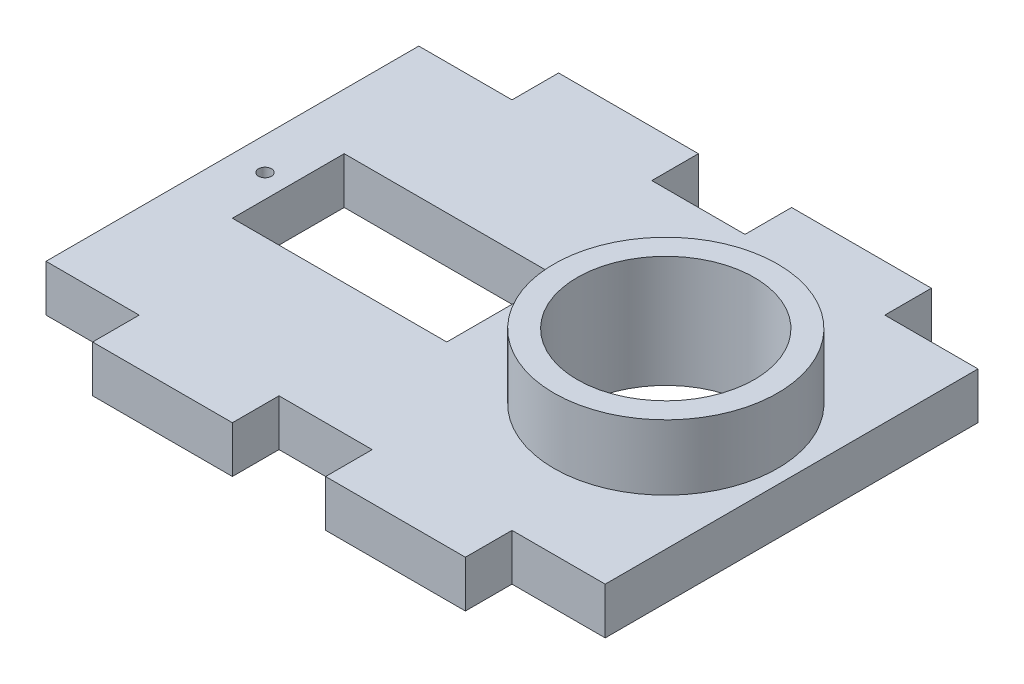
ISO-10303-21;
HEADER;
FILE_DESCRIPTION(('STEP AP214'),'2;1');
FILE_NAME('part.step','',(''),(''),'','','');
FILE_SCHEMA(('AUTOMOTIVE_DESIGN { 1 0 10303 214 1 1 1 1 }'));
ENDSEC;
DATA;
#1=APPLICATION_CONTEXT('core data for automotive mechanical design processes');
#2=APPLICATION_PROTOCOL_DEFINITION('international standard','automotive_design',2000,#1);
#3=PRODUCT_CONTEXT('',#1,'mechanical');
#4=PRODUCT('Part','Part','',(#3));
#5=PRODUCT_RELATED_PRODUCT_CATEGORY('part','',(#4));
#6=PRODUCT_DEFINITION_FORMATION('','',#4);
#7=PRODUCT_DEFINITION_CONTEXT('part definition',#1,'design');
#8=PRODUCT_DEFINITION('design','',#6,#7);
#9=PRODUCT_DEFINITION_SHAPE('','',#8);
#10=(LENGTH_UNIT() NAMED_UNIT(*) SI_UNIT(.MILLI.,.METRE.));
#11=(NAMED_UNIT(*) PLANE_ANGLE_UNIT() SI_UNIT($,.RADIAN.));
#12=(NAMED_UNIT(*) SI_UNIT($,.STERADIAN.) SOLID_ANGLE_UNIT());
#13=UNCERTAINTY_MEASURE_WITH_UNIT(LENGTH_MEASURE(1.E-05),#10,'distance_accuracy_value','');
#14=(GEOMETRIC_REPRESENTATION_CONTEXT(3) GLOBAL_UNCERTAINTY_ASSIGNED_CONTEXT((#13)) GLOBAL_UNIT_ASSIGNED_CONTEXT((#10,
#11,#12)) REPRESENTATION_CONTEXT('',''));
#15=CARTESIAN_POINT('',(0.,0.,0.));
#16=DIRECTION('',(0.,0.,1.));
#17=DIRECTION('',(1.,0.,0.));
#18=AXIS2_PLACEMENT_3D('',#15,#16,#17);
#19=CARTESIAN_POINT('',(0.,5.,0.));
#20=DIRECTION('',(0.,1.,0.));
#21=DIRECTION('',(0.,0.,1.));
#22=AXIS2_PLACEMENT_3D('',#19,#20,#21);
#23=PLANE('',#22);
#24=CARTESIAN_POINT('',(-14.,5.,0.));
#25=DIRECTION('',(0.,1.,0.));
#26=DIRECTION('',(0.,0.,1.));
#27=AXIS2_PLACEMENT_3D('',#24,#25,#26);
#28=CIRCLE('',#27,0.7);
#29=CARTESIAN_POINT('',(-14.,5.,0.7));
#30=VERTEX_POINT('',#29);
#31=EDGE_CURVE('E260',#30,#30,#28,.T.);
#32=ORIENTED_EDGE('',*,*,#31,.F.);
#33=EDGE_LOOP('',(#32));
#34=FACE_BOUND('',#33,.T.);
#35=DIRECTION('',(-1.,0.,0.));
#36=VECTOR('',#35,1.);
#37=CARTESIAN_POINT('',(32.5,5.,-20.));
#38=LINE('',#37,#36);
#39=CARTESIAN_POINT('',(42.5,5.,-20.));
#40=VERTEX_POINT('',#39);
#41=CARTESIAN_POINT('',(32.5,5.,-20.));
#42=VERTEX_POINT('',#41);
#43=EDGE_CURVE('E268',#40,#42,#38,.T.);
#44=ORIENTED_EDGE('',*,*,#43,.T.);
#45=DIRECTION('',(0.,0.,-1.));
#46=VECTOR('',#45,1.);
#47=CARTESIAN_POINT('',(32.5,5.,-20.));
#48=LINE('',#47,#46);
#49=CARTESIAN_POINT('',(32.5,5.,-25.));
#50=VERTEX_POINT('',#49);
#51=EDGE_CURVE('E272',#42,#50,#48,.T.);
#52=ORIENTED_EDGE('',*,*,#51,.T.);
#53=DIRECTION('',(-1.,0.,0.));
#54=VECTOR('',#53,1.);
#55=CARTESIAN_POINT('',(32.5,5.,-25.));
#56=LINE('',#55,#54);
#57=CARTESIAN_POINT('',(17.5,5.,-25.));
#58=VERTEX_POINT('',#57);
#59=EDGE_CURVE('E276',#50,#58,#56,.T.);
#60=ORIENTED_EDGE('',*,*,#59,.T.);
#61=DIRECTION('',(0.,0.,1.));
#62=VECTOR('',#61,1.);
#63=CARTESIAN_POINT('',(17.5,5.,-20.));
#64=LINE('',#63,#62);
#65=CARTESIAN_POINT('',(17.5,5.,-20.));
#66=VERTEX_POINT('',#65);
#67=EDGE_CURVE('E279',#58,#66,#64,.T.);
#68=ORIENTED_EDGE('',*,*,#67,.T.);
#69=DIRECTION('',(-1.,0.,0.));
#70=VECTOR('',#69,1.);
#71=CARTESIAN_POINT('',(7.5,5.,-20.));
#72=LINE('',#71,#70);
#73=CARTESIAN_POINT('',(7.5,5.,-20.));
#74=VERTEX_POINT('',#73);
#75=EDGE_CURVE('E282',#66,#74,#72,.T.);
#76=ORIENTED_EDGE('',*,*,#75,.T.);
#77=DIRECTION('',(0.,0.,-1.));
#78=VECTOR('',#77,1.);
#79=CARTESIAN_POINT('',(7.5,5.,-20.));
#80=LINE('',#79,#78);
#81=CARTESIAN_POINT('',(7.5,5.,-25.));
#82=VERTEX_POINT('',#81);
#83=EDGE_CURVE('E285',#74,#82,#80,.T.);
#84=ORIENTED_EDGE('',*,*,#83,.T.);
#85=DIRECTION('',(-1.,0.,0.));
#86=VECTOR('',#85,1.);
#87=CARTESIAN_POINT('',(-7.5,5.,-25.));
#88=LINE('',#87,#86);
#89=CARTESIAN_POINT('',(-7.5,5.,-25.));
#90=VERTEX_POINT('',#89);
#91=EDGE_CURVE('E288',#82,#90,#88,.T.);
#92=ORIENTED_EDGE('',*,*,#91,.T.);
#93=DIRECTION('',(0.,0.,1.));
#94=VECTOR('',#93,1.);
#95=CARTESIAN_POINT('',(-7.5,5.,-20.));
#96=LINE('',#95,#94);
#97=CARTESIAN_POINT('',(-7.5,5.,-20.));
#98=VERTEX_POINT('',#97);
#99=EDGE_CURVE('E291',#90,#98,#96,.T.);
#100=ORIENTED_EDGE('',*,*,#99,.T.);
#101=DIRECTION('',(-1.,0.,0.));
#102=VECTOR('',#101,1.);
#103=CARTESIAN_POINT('',(-17.5,5.,-20.));
#104=LINE('',#103,#102);
#105=CARTESIAN_POINT('',(-17.5,5.,-20.));
#106=VERTEX_POINT('',#105);
#107=EDGE_CURVE('E294',#98,#106,#104,.T.);
#108=ORIENTED_EDGE('',*,*,#107,.T.);
#109=DIRECTION('',(0.,0.,1.));
#110=VECTOR('',#109,1.);
#111=CARTESIAN_POINT('',(-17.5,5.,20.));
#112=LINE('',#111,#110);
#113=CARTESIAN_POINT('',(-17.5,5.,20.));
#114=VERTEX_POINT('',#113);
#115=EDGE_CURVE('E297',#106,#114,#112,.T.);
#116=ORIENTED_EDGE('',*,*,#115,.T.);
#117=DIRECTION('',(1.,0.,0.));
#118=VECTOR('',#117,1.);
#119=CARTESIAN_POINT('',(-17.5,5.,20.));
#120=LINE('',#119,#118);
#121=CARTESIAN_POINT('',(-7.49999999999999,5.,20.));
#122=VERTEX_POINT('',#121);
#123=EDGE_CURVE('E300',#114,#122,#120,.T.);
#124=ORIENTED_EDGE('',*,*,#123,.T.);
#125=DIRECTION('',(0.,0.,1.));
#126=VECTOR('',#125,1.);
#127=CARTESIAN_POINT('',(-7.49999999999999,5.,20.));
#128=LINE('',#127,#126);
#129=CARTESIAN_POINT('',(-7.49999999999999,5.,25.));
#130=VERTEX_POINT('',#129);
#131=EDGE_CURVE('E303',#122,#130,#128,.T.);
#132=ORIENTED_EDGE('',*,*,#131,.T.);
#133=DIRECTION('',(1.,0.,0.));
#134=VECTOR('',#133,1.);
#135=CARTESIAN_POINT('',(-7.49999999999999,5.,25.));
#136=LINE('',#135,#134);
#137=CARTESIAN_POINT('',(7.50000000000001,5.,25.));
#138=VERTEX_POINT('',#137);
#139=EDGE_CURVE('E306',#130,#138,#136,.T.);
#140=ORIENTED_EDGE('',*,*,#139,.T.);
#141=DIRECTION('',(0.,0.,-1.));
#142=VECTOR('',#141,1.);
#143=CARTESIAN_POINT('',(7.5,5.,20.));
#144=LINE('',#143,#142);
#145=CARTESIAN_POINT('',(7.5,5.,20.));
#146=VERTEX_POINT('',#145);
#147=EDGE_CURVE('E309',#138,#146,#144,.T.);
#148=ORIENTED_EDGE('',*,*,#147,.T.);
#149=DIRECTION('',(1.,0.,0.));
#150=VECTOR('',#149,1.);
#151=CARTESIAN_POINT('',(7.5,5.,20.));
#152=LINE('',#151,#150);
#153=CARTESIAN_POINT('',(17.5,5.,20.));
#154=VERTEX_POINT('',#153);
#155=EDGE_CURVE('E312',#146,#154,#152,.T.);
#156=ORIENTED_EDGE('',*,*,#155,.T.);
#157=DIRECTION('',(0.,0.,1.));
#158=VECTOR('',#157,1.);
#159=CARTESIAN_POINT('',(17.5,5.,20.));
#160=LINE('',#159,#158);
#161=CARTESIAN_POINT('',(17.5,5.,25.));
#162=VERTEX_POINT('',#161);
#163=EDGE_CURVE('E315',#154,#162,#160,.T.);
#164=ORIENTED_EDGE('',*,*,#163,.T.);
#165=DIRECTION('',(1.,0.,0.));
#166=VECTOR('',#165,1.);
#167=CARTESIAN_POINT('',(32.5,5.,25.));
#168=LINE('',#167,#166);
#169=CARTESIAN_POINT('',(32.5,5.,25.));
#170=VERTEX_POINT('',#169);
#171=EDGE_CURVE('E318',#162,#170,#168,.T.);
#172=ORIENTED_EDGE('',*,*,#171,.T.);
#173=DIRECTION('',(0.,0.,-1.));
#174=VECTOR('',#173,1.);
#175=CARTESIAN_POINT('',(32.5,5.,20.));
#176=LINE('',#175,#174);
#177=CARTESIAN_POINT('',(32.5,5.,20.));
#178=VERTEX_POINT('',#177);
#179=EDGE_CURVE('E321',#170,#178,#176,.T.);
#180=ORIENTED_EDGE('',*,*,#179,.T.);
#181=DIRECTION('',(1.,0.,0.));
#182=VECTOR('',#181,1.);
#183=CARTESIAN_POINT('',(32.5,5.,20.));
#184=LINE('',#183,#182);
#185=CARTESIAN_POINT('',(42.5,5.,20.));
#186=VERTEX_POINT('',#185);
#187=EDGE_CURVE('E324',#178,#186,#184,.T.);
#188=ORIENTED_EDGE('',*,*,#187,.T.);
#189=DIRECTION('',(0.,0.,-1.));
#190=VECTOR('',#189,1.);
#191=CARTESIAN_POINT('',(42.5,5.,20.));
#192=LINE('',#191,#190);
#193=EDGE_CURVE('E327',#186,#40,#192,.T.);
#194=ORIENTED_EDGE('',*,*,#193,.T.);
#195=EDGE_LOOP('',(#44,#52,#60,#68,#76,#84,#92,#100,#108,#116,#124,#132,#140,#148,#156,#164,
#172,#180,#188,#194));
#196=FACE_BOUND('',#195,.T.);
#197=CARTESIAN_POINT('',(14.,5.,0.));
#198=DIRECTION('',(0.,1.,0.));
#199=DIRECTION('',(0.,0.,1.));
#200=AXIS2_PLACEMENT_3D('',#197,#198,#199);
#201=CIRCLE('',#200,0.7);
#202=CARTESIAN_POINT('',(14.,5.,0.7));
#203=VERTEX_POINT('',#202);
#204=EDGE_CURVE('E252',#203,#203,#201,.T.);
#205=ORIENTED_EDGE('',*,*,#204,.F.);
#206=EDGE_LOOP('',(#205));
#207=FACE_BOUND('',#206,.T.);
#208=DIRECTION('',(-1.,0.,0.));
#209=VECTOR('',#208,1.);
#210=CARTESIAN_POINT('',(-11.5,5.,-6.));
#211=LINE('',#210,#209);
#212=CARTESIAN_POINT('',(11.5,5.,-6.));
#213=VERTEX_POINT('',#212);
#214=CARTESIAN_POINT('',(-11.5,5.,-6.));
#215=VERTEX_POINT('',#214);
#216=EDGE_CURVE('E210',#213,#215,#211,.T.);
#217=ORIENTED_EDGE('',*,*,#216,.F.);
#218=DIRECTION('',(0.,0.,-1.));
#219=VECTOR('',#218,1.);
#220=CARTESIAN_POINT('',(11.5,5.,6.));
#221=LINE('',#220,#219);
#222=CARTESIAN_POINT('',(11.5,5.,6.));
#223=VERTEX_POINT('',#222);
#224=EDGE_CURVE('E201',#223,#213,#221,.T.);
#225=ORIENTED_EDGE('',*,*,#224,.F.);
#226=DIRECTION('',(1.,0.,0.));
#227=VECTOR('',#226,1.);
#228=CARTESIAN_POINT('',(-11.5,5.,6.));
#229=LINE('',#228,#227);
#230=CARTESIAN_POINT('',(-11.5,5.,6.));
#231=VERTEX_POINT('',#230);
#232=EDGE_CURVE('E228',#231,#223,#229,.T.);
#233=ORIENTED_EDGE('',*,*,#232,.F.);
#234=DIRECTION('',(0.,0.,1.));
#235=VECTOR('',#234,1.);
#236=CARTESIAN_POINT('',(-11.5,5.,6.));
#237=LINE('',#236,#235);
#238=EDGE_CURVE('E224',#215,#231,#237,.T.);
#239=ORIENTED_EDGE('',*,*,#238,.F.);
#240=EDGE_LOOP('',(#217,#225,#233,#239));
#241=FACE_BOUND('',#240,.T.);
#242=CARTESIAN_POINT('',(29.,5.,0.));
#243=DIRECTION('',(0.,1.,0.));
#244=DIRECTION('',(0.,0.,1.));
#245=AXIS2_PLACEMENT_3D('',#242,#243,#244);
#246=CIRCLE('',#245,12.);
#247=CARTESIAN_POINT('',(29.,5.,-12.));
#248=VERTEX_POINT('',#247);
#249=EDGE_CURVE('E835',#248,#248,#246,.T.);
#250=ORIENTED_EDGE('',*,*,#249,.F.);
#251=EDGE_LOOP('',(#250));
#252=FACE_BOUND('',#251,.T.);
#253=ADVANCED_FACE('F39',(#34,#196,#207,#241,#252),#23,.T.);
#254=CARTESIAN_POINT('',(0.,0.,0.));
#255=DIRECTION('',(0.,1.,0.));
#256=DIRECTION('',(0.,0.,1.));
#257=AXIS2_PLACEMENT_3D('',#254,#255,#256);
#258=PLANE('',#257);
#259=CARTESIAN_POINT('',(14.,0.,0.));
#260=DIRECTION('',(0.,1.,0.));
#261=DIRECTION('',(0.,0.,1.));
#262=AXIS2_PLACEMENT_3D('',#259,#260,#261);
#263=CIRCLE('',#262,0.7);
#264=CARTESIAN_POINT('',(14.,0.,0.7));
#265=VERTEX_POINT('',#264);
#266=EDGE_CURVE('E219',#265,#265,#263,.T.);
#267=ORIENTED_EDGE('',*,*,#266,.T.);
#268=EDGE_LOOP('',(#267));
#269=FACE_BOUND('',#268,.T.);
#270=CARTESIAN_POINT('',(-14.,0.,0.));
#271=DIRECTION('',(0.,1.,0.));
#272=DIRECTION('',(0.,0.,1.));
#273=AXIS2_PLACEMENT_3D('',#270,#271,#272);
#274=CIRCLE('',#273,0.7);
#275=CARTESIAN_POINT('',(-14.,0.,0.7));
#276=VERTEX_POINT('',#275);
#277=EDGE_CURVE('E256',#276,#276,#274,.T.);
#278=ORIENTED_EDGE('',*,*,#277,.T.);
#279=EDGE_LOOP('',(#278));
#280=FACE_BOUND('',#279,.T.);
#281=DIRECTION('',(-1.,0.,0.));
#282=VECTOR('',#281,1.);
#283=CARTESIAN_POINT('',(32.5,0.,-20.));
#284=LINE('',#283,#282);
#285=CARTESIAN_POINT('',(42.5,0.,-20.));
#286=VERTEX_POINT('',#285);
#287=CARTESIAN_POINT('',(32.5,0.,-20.));
#288=VERTEX_POINT('',#287);
#289=EDGE_CURVE('E264',#286,#288,#284,.T.);
#290=ORIENTED_EDGE('',*,*,#289,.F.);
#291=DIRECTION('',(0.,0.,-1.));
#292=VECTOR('',#291,1.);
#293=CARTESIAN_POINT('',(42.5,0.,20.));
#294=LINE('',#293,#292);
#295=CARTESIAN_POINT('',(42.5,0.,20.));
#296=VERTEX_POINT('',#295);
#297=EDGE_CURVE('E273',#296,#286,#294,.T.);
#298=ORIENTED_EDGE('',*,*,#297,.F.);
#299=DIRECTION('',(1.,0.,0.));
#300=VECTOR('',#299,1.);
#301=CARTESIAN_POINT('',(32.5,0.,20.));
#302=LINE('',#301,#300);
#303=CARTESIAN_POINT('',(32.5,0.,20.));
#304=VERTEX_POINT('',#303);
#305=EDGE_CURVE('E385',#304,#296,#302,.T.);
#306=ORIENTED_EDGE('',*,*,#305,.F.);
#307=DIRECTION('',(0.,0.,-1.));
#308=VECTOR('',#307,1.);
#309=CARTESIAN_POINT('',(32.5,0.,20.));
#310=LINE('',#309,#308);
#311=CARTESIAN_POINT('',(32.5,0.,25.));
#312=VERTEX_POINT('',#311);
#313=EDGE_CURVE('E382',#312,#304,#310,.T.);
#314=ORIENTED_EDGE('',*,*,#313,.F.);
#315=DIRECTION('',(1.,0.,0.));
#316=VECTOR('',#315,1.);
#317=CARTESIAN_POINT('',(32.5,0.,25.));
#318=LINE('',#317,#316);
#319=CARTESIAN_POINT('',(17.5,0.,25.));
#320=VERTEX_POINT('',#319);
#321=EDGE_CURVE('E379',#320,#312,#318,.T.);
#322=ORIENTED_EDGE('',*,*,#321,.F.);
#323=DIRECTION('',(0.,0.,1.));
#324=VECTOR('',#323,1.);
#325=CARTESIAN_POINT('',(17.5,0.,20.));
#326=LINE('',#325,#324);
#327=CARTESIAN_POINT('',(17.5,0.,20.));
#328=VERTEX_POINT('',#327);
#329=EDGE_CURVE('E376',#328,#320,#326,.T.);
#330=ORIENTED_EDGE('',*,*,#329,.F.);
#331=DIRECTION('',(1.,0.,0.));
#332=VECTOR('',#331,1.);
#333=CARTESIAN_POINT('',(7.5,0.,20.));
#334=LINE('',#333,#332);
#335=CARTESIAN_POINT('',(7.5,0.,20.));
#336=VERTEX_POINT('',#335);
#337=EDGE_CURVE('E373',#336,#328,#334,.T.);
#338=ORIENTED_EDGE('',*,*,#337,.F.);
#339=DIRECTION('',(0.,0.,-1.));
#340=VECTOR('',#339,1.);
#341=CARTESIAN_POINT('',(7.5,0.,20.));
#342=LINE('',#341,#340);
#343=CARTESIAN_POINT('',(7.50000000000001,0.,25.));
#344=VERTEX_POINT('',#343);
#345=EDGE_CURVE('E370',#344,#336,#342,.T.);
#346=ORIENTED_EDGE('',*,*,#345,.F.);
#347=DIRECTION('',(1.,0.,0.));
#348=VECTOR('',#347,1.);
#349=CARTESIAN_POINT('',(-7.49999999999999,0.,25.));
#350=LINE('',#349,#348);
#351=CARTESIAN_POINT('',(-7.49999999999999,0.,25.));
#352=VERTEX_POINT('',#351);
#353=EDGE_CURVE('E367',#352,#344,#350,.T.);
#354=ORIENTED_EDGE('',*,*,#353,.F.);
#355=DIRECTION('',(0.,0.,1.));
#356=VECTOR('',#355,1.);
#357=CARTESIAN_POINT('',(-7.49999999999999,0.,20.));
#358=LINE('',#357,#356);
#359=CARTESIAN_POINT('',(-7.49999999999999,0.,20.));
#360=VERTEX_POINT('',#359);
#361=EDGE_CURVE('E364',#360,#352,#358,.T.);
#362=ORIENTED_EDGE('',*,*,#361,.F.);
#363=DIRECTION('',(1.,0.,0.));
#364=VECTOR('',#363,1.);
#365=CARTESIAN_POINT('',(-17.5,0.,20.));
#366=LINE('',#365,#364);
#367=CARTESIAN_POINT('',(-17.5,0.,20.));
#368=VERTEX_POINT('',#367);
#369=EDGE_CURVE('E361',#368,#360,#366,.T.);
#370=ORIENTED_EDGE('',*,*,#369,.F.);
#371=DIRECTION('',(0.,0.,1.));
#372=VECTOR('',#371,1.);
#373=CARTESIAN_POINT('',(-17.5,0.,20.));
#374=LINE('',#373,#372);
#375=CARTESIAN_POINT('',(-17.5,0.,-20.));
#376=VERTEX_POINT('',#375);
#377=EDGE_CURVE('E358',#376,#368,#374,.T.);
#378=ORIENTED_EDGE('',*,*,#377,.F.);
#379=DIRECTION('',(-1.,0.,0.));
#380=VECTOR('',#379,1.);
#381=CARTESIAN_POINT('',(-17.5,0.,-20.));
#382=LINE('',#381,#380);
#383=CARTESIAN_POINT('',(-7.5,0.,-20.));
#384=VERTEX_POINT('',#383);
#385=EDGE_CURVE('E355',#384,#376,#382,.T.);
#386=ORIENTED_EDGE('',*,*,#385,.F.);
#387=DIRECTION('',(0.,0.,1.));
#388=VECTOR('',#387,1.);
#389=CARTESIAN_POINT('',(-7.5,0.,-20.));
#390=LINE('',#389,#388);
#391=CARTESIAN_POINT('',(-7.5,0.,-25.));
#392=VERTEX_POINT('',#391);
#393=EDGE_CURVE('E352',#392,#384,#390,.T.);
#394=ORIENTED_EDGE('',*,*,#393,.F.);
#395=DIRECTION('',(-1.,0.,0.));
#396=VECTOR('',#395,1.);
#397=CARTESIAN_POINT('',(-7.5,0.,-25.));
#398=LINE('',#397,#396);
#399=CARTESIAN_POINT('',(7.5,0.,-25.));
#400=VERTEX_POINT('',#399);
#401=EDGE_CURVE('E349',#400,#392,#398,.T.);
#402=ORIENTED_EDGE('',*,*,#401,.F.);
#403=DIRECTION('',(0.,0.,-1.));
#404=VECTOR('',#403,1.);
#405=CARTESIAN_POINT('',(7.5,0.,-20.));
#406=LINE('',#405,#404);
#407=CARTESIAN_POINT('',(7.5,0.,-20.));
#408=VERTEX_POINT('',#407);
#409=EDGE_CURVE('E346',#408,#400,#406,.T.);
#410=ORIENTED_EDGE('',*,*,#409,.F.);
#411=DIRECTION('',(-1.,0.,0.));
#412=VECTOR('',#411,1.);
#413=CARTESIAN_POINT('',(7.5,0.,-20.));
#414=LINE('',#413,#412);
#415=CARTESIAN_POINT('',(17.5,0.,-20.));
#416=VERTEX_POINT('',#415);
#417=EDGE_CURVE('E343',#416,#408,#414,.T.);
#418=ORIENTED_EDGE('',*,*,#417,.F.);
#419=DIRECTION('',(0.,0.,1.));
#420=VECTOR('',#419,1.);
#421=CARTESIAN_POINT('',(17.5,0.,-20.));
#422=LINE('',#421,#420);
#423=CARTESIAN_POINT('',(17.5,0.,-25.));
#424=VERTEX_POINT('',#423);
#425=EDGE_CURVE('E340',#424,#416,#422,.T.);
#426=ORIENTED_EDGE('',*,*,#425,.F.);
#427=DIRECTION('',(-1.,0.,0.));
#428=VECTOR('',#427,1.);
#429=CARTESIAN_POINT('',(32.5,0.,-25.));
#430=LINE('',#429,#428);
#431=CARTESIAN_POINT('',(32.5,0.,-25.));
#432=VERTEX_POINT('',#431);
#433=EDGE_CURVE('E337',#432,#424,#430,.T.);
#434=ORIENTED_EDGE('',*,*,#433,.F.);
#435=DIRECTION('',(0.,0.,-1.));
#436=VECTOR('',#435,1.);
#437=CARTESIAN_POINT('',(32.5,0.,-20.));
#438=LINE('',#437,#436);
#439=EDGE_CURVE('E334',#288,#432,#438,.T.);
#440=ORIENTED_EDGE('',*,*,#439,.F.);
#441=EDGE_LOOP('',(#290,#298,#306,#314,#322,#330,#338,#346,#354,#362,#370,#378,#386,#394,#402,
#410,#418,#426,#434,#440));
#442=FACE_BOUND('',#441,.T.);
#443=DIRECTION('',(0.,0.,-1.));
#444=VECTOR('',#443,1.);
#445=CARTESIAN_POINT('',(11.5,0.,6.));
#446=LINE('',#445,#444);
#447=CARTESIAN_POINT('',(11.5,0.,6.));
#448=VERTEX_POINT('',#447);
#449=CARTESIAN_POINT('',(11.5,0.,-6.));
#450=VERTEX_POINT('',#449);
#451=EDGE_CURVE('E63',#448,#450,#446,.T.);
#452=ORIENTED_EDGE('',*,*,#451,.T.);
#453=DIRECTION('',(-1.,0.,0.));
#454=VECTOR('',#453,1.);
#455=CARTESIAN_POINT('',(-11.5,0.,-6.));
#456=LINE('',#455,#454);
#457=CARTESIAN_POINT('',(-11.5,0.,-6.));
#458=VERTEX_POINT('',#457);
#459=EDGE_CURVE('E217',#450,#458,#456,.T.);
#460=ORIENTED_EDGE('',*,*,#459,.T.);
#461=DIRECTION('',(0.,0.,1.));
#462=VECTOR('',#461,1.);
#463=CARTESIAN_POINT('',(-11.5,0.,6.));
#464=LINE('',#463,#462);
#465=CARTESIAN_POINT('',(-11.5,0.,6.));
#466=VERTEX_POINT('',#465);
#467=EDGE_CURVE('E239',#458,#466,#464,.T.);
#468=ORIENTED_EDGE('',*,*,#467,.T.);
#469=DIRECTION('',(1.,0.,0.));
#470=VECTOR('',#469,1.);
#471=CARTESIAN_POINT('',(-11.5,0.,6.));
#472=LINE('',#471,#470);
#473=EDGE_CURVE('E211',#466,#448,#472,.T.);
#474=ORIENTED_EDGE('',*,*,#473,.T.);
#475=EDGE_LOOP('',(#452,#460,#468,#474));
#476=FACE_BOUND('',#475,.T.);
#477=CARTESIAN_POINT('',(29.,0.,0.));
#478=DIRECTION('',(0.,1.,0.));
#479=DIRECTION('',(0.,0.,1.));
#480=AXIS2_PLACEMENT_3D('',#477,#478,#479);
#481=CIRCLE('',#480,9.5);
#482=CARTESIAN_POINT('',(29.,0.,9.5));
#483=VERTEX_POINT('',#482);
#484=EDGE_CURVE('E236',#483,#483,#481,.T.);
#485=ORIENTED_EDGE('',*,*,#484,.T.);
#486=EDGE_LOOP('',(#485));
#487=FACE_BOUND('',#486,.T.);
#488=ADVANCED_FACE('F472',(#269,#280,#442,#476,#487),#258,.F.);
#489=CARTESIAN_POINT('',(32.5,5.,-20.));
#490=DIRECTION('',(0.,0.,1.));
#491=DIRECTION('',(1.,0.,0.));
#492=AXIS2_PLACEMENT_3D('',#489,#490,#491);
#493=PLANE('',#492);
#494=ORIENTED_EDGE('',*,*,#289,.T.);
#495=DIRECTION('',(0.,-1.,0.));
#496=VECTOR('',#495,1.);
#497=CARTESIAN_POINT('',(32.5,5.,-20.));
#498=LINE('',#497,#496);
#499=EDGE_CURVE('E11',#42,#288,#498,.T.);
#500=ORIENTED_EDGE('',*,*,#499,.F.);
#501=ORIENTED_EDGE('',*,*,#43,.F.);
#502=DIRECTION('',(0.,-1.,0.));
#503=VECTOR('',#502,1.);
#504=CARTESIAN_POINT('',(42.5,5.,-20.));
#505=LINE('',#504,#503);
#506=EDGE_CURVE('E330',#40,#286,#505,.T.);
#507=ORIENTED_EDGE('',*,*,#506,.T.);
#508=EDGE_LOOP('',(#494,#500,#501,#507));
#509=FACE_BOUND('',#508,.T.);
#510=ADVANCED_FACE('F41',(#509),#493,.F.);
#511=CARTESIAN_POINT('',(32.5,5.,-20.));
#512=DIRECTION('',(-1.,0.,0.));
#513=DIRECTION('',(0.,0.,1.));
#514=AXIS2_PLACEMENT_3D('',#511,#512,#513);
#515=PLANE('',#514);
#516=ORIENTED_EDGE('',*,*,#439,.T.);
#517=DIRECTION('',(0.,-1.,0.));
#518=VECTOR('',#517,1.);
#519=CARTESIAN_POINT('',(32.5,5.,-25.));
#520=LINE('',#519,#518);
#521=EDGE_CURVE('E48',#50,#432,#520,.T.);
#522=ORIENTED_EDGE('',*,*,#521,.F.);
#523=ORIENTED_EDGE('',*,*,#51,.F.);
#524=ORIENTED_EDGE('',*,*,#499,.T.);
#525=EDGE_LOOP('',(#516,#522,#523,#524));
#526=FACE_BOUND('',#525,.T.);
#527=ADVANCED_FACE('F490',(#526),#515,.F.);
#528=CARTESIAN_POINT('',(32.5,5.,-25.));
#529=DIRECTION('',(0.,0.,1.));
#530=DIRECTION('',(1.,0.,0.));
#531=AXIS2_PLACEMENT_3D('',#528,#529,#530);
#532=PLANE('',#531);
#533=ORIENTED_EDGE('',*,*,#433,.T.);
#534=DIRECTION('',(0.,-1.,0.));
#535=VECTOR('',#534,1.);
#536=CARTESIAN_POINT('',(17.5,5.,-25.));
#537=LINE('',#536,#535);
#538=EDGE_CURVE('E457',#58,#424,#537,.T.);
#539=ORIENTED_EDGE('',*,*,#538,.F.);
#540=ORIENTED_EDGE('',*,*,#59,.F.);
#541=ORIENTED_EDGE('',*,*,#521,.T.);
#542=EDGE_LOOP('',(#533,#539,#540,#541));
#543=FACE_BOUND('',#542,.T.);
#544=ADVANCED_FACE('F466',(#543),#532,.F.);
#545=CARTESIAN_POINT('',(17.5,5.,-20.));
#546=DIRECTION('',(1.,0.,0.));
#547=DIRECTION('',(0.,0.,-1.));
#548=AXIS2_PLACEMENT_3D('',#545,#546,#547);
#549=PLANE('',#548);
#550=ORIENTED_EDGE('',*,*,#425,.T.);
#551=DIRECTION('',(0.,-1.,0.));
#552=VECTOR('',#551,1.);
#553=CARTESIAN_POINT('',(17.5,5.,-20.));
#554=LINE('',#553,#552);
#555=EDGE_CURVE('E453',#66,#416,#554,.T.);
#556=ORIENTED_EDGE('',*,*,#555,.F.);
#557=ORIENTED_EDGE('',*,*,#67,.F.);
#558=ORIENTED_EDGE('',*,*,#538,.T.);
#559=EDGE_LOOP('',(#550,#556,#557,#558));
#560=FACE_BOUND('',#559,.T.);
#561=ADVANCED_FACE('F478',(#560),#549,.F.);
#562=CARTESIAN_POINT('',(7.5,5.,-20.));
#563=DIRECTION('',(0.,0.,1.));
#564=DIRECTION('',(1.,0.,0.));
#565=AXIS2_PLACEMENT_3D('',#562,#563,#564);
#566=PLANE('',#565);
#567=ORIENTED_EDGE('',*,*,#417,.T.);
#568=DIRECTION('',(0.,-1.,0.));
#569=VECTOR('',#568,1.);
#570=CARTESIAN_POINT('',(7.5,5.,-20.));
#571=LINE('',#570,#569);
#572=EDGE_CURVE('E449',#74,#408,#571,.T.);
#573=ORIENTED_EDGE('',*,*,#572,.F.);
#574=ORIENTED_EDGE('',*,*,#75,.F.);
#575=ORIENTED_EDGE('',*,*,#555,.T.);
#576=EDGE_LOOP('',(#567,#573,#574,#575));
#577=FACE_BOUND('',#576,.T.);
#578=ADVANCED_FACE('F482',(#577),#566,.F.);
#579=CARTESIAN_POINT('',(7.5,5.,-20.));
#580=DIRECTION('',(-1.,0.,0.));
#581=DIRECTION('',(0.,0.,1.));
#582=AXIS2_PLACEMENT_3D('',#579,#580,#581);
#583=PLANE('',#582);
#584=ORIENTED_EDGE('',*,*,#409,.T.);
#585=DIRECTION('',(0.,-1.,0.));
#586=VECTOR('',#585,1.);
#587=CARTESIAN_POINT('',(7.5,5.,-25.));
#588=LINE('',#587,#586);
#589=EDGE_CURVE('E445',#82,#400,#588,.T.);
#590=ORIENTED_EDGE('',*,*,#589,.F.);
#591=ORIENTED_EDGE('',*,*,#83,.F.);
#592=ORIENTED_EDGE('',*,*,#572,.T.);
#593=EDGE_LOOP('',(#584,#590,#591,#592));
#594=FACE_BOUND('',#593,.T.);
#595=ADVANCED_FACE('F563',(#594),#583,.F.);
#596=CARTESIAN_POINT('',(-7.5,5.,-25.));
#597=DIRECTION('',(0.,0.,1.));
#598=DIRECTION('',(1.,0.,0.));
#599=AXIS2_PLACEMENT_3D('',#596,#597,#598);
#600=PLANE('',#599);
#601=ORIENTED_EDGE('',*,*,#401,.T.);
#602=DIRECTION('',(0.,-1.,0.));
#603=VECTOR('',#602,1.);
#604=CARTESIAN_POINT('',(-7.5,5.,-25.));
#605=LINE('',#604,#603);
#606=EDGE_CURVE('E441',#90,#392,#605,.T.);
#607=ORIENTED_EDGE('',*,*,#606,.F.);
#608=ORIENTED_EDGE('',*,*,#91,.F.);
#609=ORIENTED_EDGE('',*,*,#589,.T.);
#610=EDGE_LOOP('',(#601,#607,#608,#609));
#611=FACE_BOUND('',#610,.T.);
#612=ADVANCED_FACE('F561',(#611),#600,.F.);
#613=CARTESIAN_POINT('',(-7.5,5.,-20.));
#614=DIRECTION('',(1.,0.,0.));
#615=DIRECTION('',(0.,0.,-1.));
#616=AXIS2_PLACEMENT_3D('',#613,#614,#615);
#617=PLANE('',#616);
#618=ORIENTED_EDGE('',*,*,#393,.T.);
#619=DIRECTION('',(0.,-1.,0.));
#620=VECTOR('',#619,1.);
#621=CARTESIAN_POINT('',(-7.5,5.,-20.));
#622=LINE('',#621,#620);
#623=EDGE_CURVE('E437',#98,#384,#622,.T.);
#624=ORIENTED_EDGE('',*,*,#623,.F.);
#625=ORIENTED_EDGE('',*,*,#99,.F.);
#626=ORIENTED_EDGE('',*,*,#606,.T.);
#627=EDGE_LOOP('',(#618,#624,#625,#626));
#628=FACE_BOUND('',#627,.T.);
#629=ADVANCED_FACE('F556',(#628),#617,.F.);
#630=CARTESIAN_POINT('',(-17.5,5.,-20.));
#631=DIRECTION('',(0.,0.,1.));
#632=DIRECTION('',(1.,0.,0.));
#633=AXIS2_PLACEMENT_3D('',#630,#631,#632);
#634=PLANE('',#633);
#635=ORIENTED_EDGE('',*,*,#385,.T.);
#636=DIRECTION('',(0.,-1.,0.));
#637=VECTOR('',#636,1.);
#638=CARTESIAN_POINT('',(-17.5,5.,-20.));
#639=LINE('',#638,#637);
#640=EDGE_CURVE('E433',#106,#376,#639,.T.);
#641=ORIENTED_EDGE('',*,*,#640,.F.);
#642=ORIENTED_EDGE('',*,*,#107,.F.);
#643=ORIENTED_EDGE('',*,*,#623,.T.);
#644=EDGE_LOOP('',(#635,#641,#642,#643));
#645=FACE_BOUND('',#644,.T.);
#646=ADVANCED_FACE('F551',(#645),#634,.F.);
#647=CARTESIAN_POINT('',(-17.5,5.,20.));
#648=DIRECTION('',(1.,0.,0.));
#649=DIRECTION('',(0.,0.,-1.));
#650=AXIS2_PLACEMENT_3D('',#647,#648,#649);
#651=PLANE('',#650);
#652=ORIENTED_EDGE('',*,*,#377,.T.);
#653=DIRECTION('',(0.,-1.,0.));
#654=VECTOR('',#653,1.);
#655=CARTESIAN_POINT('',(-17.5,5.,20.));
#656=LINE('',#655,#654);
#657=EDGE_CURVE('E429',#114,#368,#656,.T.);
#658=ORIENTED_EDGE('',*,*,#657,.F.);
#659=ORIENTED_EDGE('',*,*,#115,.F.);
#660=ORIENTED_EDGE('',*,*,#640,.T.);
#661=EDGE_LOOP('',(#652,#658,#659,#660));
#662=FACE_BOUND('',#661,.T.);
#663=ADVANCED_FACE('F547',(#662),#651,.F.);
#664=CARTESIAN_POINT('',(-17.5,5.,20.));
#665=DIRECTION('',(0.,0.,-1.));
#666=DIRECTION('',(-1.,0.,0.));
#667=AXIS2_PLACEMENT_3D('',#664,#665,#666);
#668=PLANE('',#667);
#669=ORIENTED_EDGE('',*,*,#369,.T.);
#670=DIRECTION('',(0.,-1.,0.));
#671=VECTOR('',#670,1.);
#672=CARTESIAN_POINT('',(-7.49999999999999,5.,20.));
#673=LINE('',#672,#671);
#674=EDGE_CURVE('E425',#122,#360,#673,.T.);
#675=ORIENTED_EDGE('',*,*,#674,.F.);
#676=ORIENTED_EDGE('',*,*,#123,.F.);
#677=ORIENTED_EDGE('',*,*,#657,.T.);
#678=EDGE_LOOP('',(#669,#675,#676,#677));
#679=FACE_BOUND('',#678,.T.);
#680=ADVANCED_FACE('F542',(#679),#668,.F.);
#681=CARTESIAN_POINT('',(-7.49999999999999,5.,20.));
#682=DIRECTION('',(1.,0.,0.));
#683=DIRECTION('',(0.,0.,-1.));
#684=AXIS2_PLACEMENT_3D('',#681,#682,#683);
#685=PLANE('',#684);
#686=ORIENTED_EDGE('',*,*,#361,.T.);
#687=DIRECTION('',(0.,-1.,0.));
#688=VECTOR('',#687,1.);
#689=CARTESIAN_POINT('',(-7.49999999999999,5.,25.));
#690=LINE('',#689,#688);
#691=EDGE_CURVE('E421',#130,#352,#690,.T.);
#692=ORIENTED_EDGE('',*,*,#691,.F.);
#693=ORIENTED_EDGE('',*,*,#131,.F.);
#694=ORIENTED_EDGE('',*,*,#674,.T.);
#695=EDGE_LOOP('',(#686,#692,#693,#694));
#696=FACE_BOUND('',#695,.T.);
#697=ADVANCED_FACE('F536',(#696),#685,.F.);
#698=CARTESIAN_POINT('',(-7.49999999999999,5.,25.));
#699=DIRECTION('',(0.,0.,-1.));
#700=DIRECTION('',(-1.,0.,0.));
#701=AXIS2_PLACEMENT_3D('',#698,#699,#700);
#702=PLANE('',#701);
#703=ORIENTED_EDGE('',*,*,#353,.T.);
#704=DIRECTION('',(0.,-1.,0.));
#705=VECTOR('',#704,1.);
#706=CARTESIAN_POINT('',(7.50000000000001,5.,25.));
#707=LINE('',#706,#705);
#708=EDGE_CURVE('E417',#138,#344,#707,.T.);
#709=ORIENTED_EDGE('',*,*,#708,.F.);
#710=ORIENTED_EDGE('',*,*,#139,.F.);
#711=ORIENTED_EDGE('',*,*,#691,.T.);
#712=EDGE_LOOP('',(#703,#709,#710,#711));
#713=FACE_BOUND('',#712,.T.);
#714=ADVANCED_FACE('F532',(#713),#702,.F.);
#715=CARTESIAN_POINT('',(7.5,5.,20.));
#716=DIRECTION('',(-1.,0.,0.));
#717=DIRECTION('',(0.,0.,1.));
#718=AXIS2_PLACEMENT_3D('',#715,#716,#717);
#719=PLANE('',#718);
#720=ORIENTED_EDGE('',*,*,#345,.T.);
#721=DIRECTION('',(0.,-1.,0.));
#722=VECTOR('',#721,1.);
#723=CARTESIAN_POINT('',(7.5,5.,20.));
#724=LINE('',#723,#722);
#725=EDGE_CURVE('E413',#146,#336,#724,.T.);
#726=ORIENTED_EDGE('',*,*,#725,.F.);
#727=ORIENTED_EDGE('',*,*,#147,.F.);
#728=ORIENTED_EDGE('',*,*,#708,.T.);
#729=EDGE_LOOP('',(#720,#726,#727,#728));
#730=FACE_BOUND('',#729,.T.);
#731=ADVANCED_FACE('F527',(#730),#719,.F.);
#732=CARTESIAN_POINT('',(7.5,5.,20.));
#733=DIRECTION('',(0.,0.,-1.));
#734=DIRECTION('',(-1.,0.,0.));
#735=AXIS2_PLACEMENT_3D('',#732,#733,#734);
#736=PLANE('',#735);
#737=ORIENTED_EDGE('',*,*,#337,.T.);
#738=DIRECTION('',(0.,-1.,0.));
#739=VECTOR('',#738,1.);
#740=CARTESIAN_POINT('',(17.5,5.,20.));
#741=LINE('',#740,#739);
#742=EDGE_CURVE('E409',#154,#328,#741,.T.);
#743=ORIENTED_EDGE('',*,*,#742,.F.);
#744=ORIENTED_EDGE('',*,*,#155,.F.);
#745=ORIENTED_EDGE('',*,*,#725,.T.);
#746=EDGE_LOOP('',(#737,#743,#744,#745));
#747=FACE_BOUND('',#746,.T.);
#748=ADVANCED_FACE('F521',(#747),#736,.F.);
#749=CARTESIAN_POINT('',(17.5,5.,20.));
#750=DIRECTION('',(1.,0.,0.));
#751=DIRECTION('',(0.,0.,-1.));
#752=AXIS2_PLACEMENT_3D('',#749,#750,#751);
#753=PLANE('',#752);
#754=ORIENTED_EDGE('',*,*,#329,.T.);
#755=DIRECTION('',(0.,-1.,0.));
#756=VECTOR('',#755,1.);
#757=CARTESIAN_POINT('',(17.5,5.,25.));
#758=LINE('',#757,#756);
#759=EDGE_CURVE('E405',#162,#320,#758,.T.);
#760=ORIENTED_EDGE('',*,*,#759,.F.);
#761=ORIENTED_EDGE('',*,*,#163,.F.);
#762=ORIENTED_EDGE('',*,*,#742,.T.);
#763=EDGE_LOOP('',(#754,#760,#761,#762));
#764=FACE_BOUND('',#763,.T.);
#765=ADVANCED_FACE('F517',(#764),#753,.F.);
#766=CARTESIAN_POINT('',(32.5,5.,25.));
#767=DIRECTION('',(0.,0.,-1.));
#768=DIRECTION('',(-1.,0.,0.));
#769=AXIS2_PLACEMENT_3D('',#766,#767,#768);
#770=PLANE('',#769);
#771=ORIENTED_EDGE('',*,*,#321,.T.);
#772=DIRECTION('',(0.,-1.,0.));
#773=VECTOR('',#772,1.);
#774=CARTESIAN_POINT('',(32.5,5.,25.));
#775=LINE('',#774,#773);
#776=EDGE_CURVE('E401',#170,#312,#775,.T.);
#777=ORIENTED_EDGE('',*,*,#776,.F.);
#778=ORIENTED_EDGE('',*,*,#171,.F.);
#779=ORIENTED_EDGE('',*,*,#759,.T.);
#780=EDGE_LOOP('',(#771,#777,#778,#779));
#781=FACE_BOUND('',#780,.T.);
#782=ADVANCED_FACE('F512',(#781),#770,.F.);
#783=CARTESIAN_POINT('',(32.5,5.,20.));
#784=DIRECTION('',(-1.,0.,0.));
#785=DIRECTION('',(0.,0.,1.));
#786=AXIS2_PLACEMENT_3D('',#783,#784,#785);
#787=PLANE('',#786);
#788=ORIENTED_EDGE('',*,*,#313,.T.);
#789=DIRECTION('',(0.,-1.,0.));
#790=VECTOR('',#789,1.);
#791=CARTESIAN_POINT('',(32.5,5.,20.));
#792=LINE('',#791,#790);
#793=EDGE_CURVE('E397',#178,#304,#792,.T.);
#794=ORIENTED_EDGE('',*,*,#793,.F.);
#795=ORIENTED_EDGE('',*,*,#179,.F.);
#796=ORIENTED_EDGE('',*,*,#776,.T.);
#797=EDGE_LOOP('',(#788,#794,#795,#796));
#798=FACE_BOUND('',#797,.T.);
#799=ADVANCED_FACE('F506',(#798),#787,.F.);
#800=CARTESIAN_POINT('',(32.5,5.,20.));
#801=DIRECTION('',(0.,0.,-1.));
#802=DIRECTION('',(-1.,0.,0.));
#803=AXIS2_PLACEMENT_3D('',#800,#801,#802);
#804=PLANE('',#803);
#805=ORIENTED_EDGE('',*,*,#305,.T.);
#806=DIRECTION('',(0.,-1.,0.));
#807=VECTOR('',#806,1.);
#808=CARTESIAN_POINT('',(42.5,5.,20.));
#809=LINE('',#808,#807);
#810=EDGE_CURVE('E393',#186,#296,#809,.T.);
#811=ORIENTED_EDGE('',*,*,#810,.F.);
#812=ORIENTED_EDGE('',*,*,#187,.F.);
#813=ORIENTED_EDGE('',*,*,#793,.T.);
#814=EDGE_LOOP('',(#805,#811,#812,#813));
#815=FACE_BOUND('',#814,.T.);
#816=ADVANCED_FACE('F502',(#815),#804,.F.);
#817=CARTESIAN_POINT('',(42.5,5.,20.));
#818=DIRECTION('',(-1.,0.,0.));
#819=DIRECTION('',(0.,0.,1.));
#820=AXIS2_PLACEMENT_3D('',#817,#818,#819);
#821=PLANE('',#820);
#822=ORIENTED_EDGE('',*,*,#297,.T.);
#823=ORIENTED_EDGE('',*,*,#506,.F.);
#824=ORIENTED_EDGE('',*,*,#193,.F.);
#825=ORIENTED_EDGE('',*,*,#810,.T.);
#826=EDGE_LOOP('',(#822,#823,#824,#825));
#827=FACE_BOUND('',#826,.T.);
#828=ADVANCED_FACE('F497',(#827),#821,.F.);
#829=CARTESIAN_POINT('',(-14.,5.,0.));
#830=DIRECTION('',(0.,-1.,0.));
#831=DIRECTION('',(0.,0.,-1.));
#832=AXIS2_PLACEMENT_3D('',#829,#830,#831);
#833=CYLINDRICAL_SURFACE('',#832,0.7);
#834=ORIENTED_EDGE('',*,*,#31,.T.);
#835=EDGE_LOOP('',(#834));
#836=FACE_BOUND('',#835,.T.);
#837=ORIENTED_EDGE('',*,*,#277,.F.);
#838=EDGE_LOOP('',(#837));
#839=FACE_BOUND('',#838,.T.);
#840=ADVANCED_FACE('F582',(#836,#839),#833,.F.);
#841=CARTESIAN_POINT('',(14.,5.,0.));
#842=DIRECTION('',(0.,-1.,0.));
#843=DIRECTION('',(0.,0.,-1.));
#844=AXIS2_PLACEMENT_3D('',#841,#842,#843);
#845=CYLINDRICAL_SURFACE('',#844,0.7);
#846=ORIENTED_EDGE('',*,*,#204,.T.);
#847=EDGE_LOOP('',(#846));
#848=FACE_BOUND('',#847,.T.);
#849=ORIENTED_EDGE('',*,*,#266,.F.);
#850=EDGE_LOOP('',(#849));
#851=FACE_BOUND('',#850,.T.);
#852=ADVANCED_FACE('F668',(#848,#851),#845,.F.);
#853=CARTESIAN_POINT('',(11.5,5.,6.));
#854=DIRECTION('',(-1.,0.,0.));
#855=DIRECTION('',(0.,0.,1.));
#856=AXIS2_PLACEMENT_3D('',#853,#854,#855);
#857=PLANE('',#856);
#858=ORIENTED_EDGE('',*,*,#451,.F.);
#859=DIRECTION('',(0.,-1.,0.));
#860=VECTOR('',#859,1.);
#861=CARTESIAN_POINT('',(11.5,5.,6.));
#862=LINE('',#861,#860);
#863=EDGE_CURVE('E205',#223,#448,#862,.T.);
#864=ORIENTED_EDGE('',*,*,#863,.F.);
#865=ORIENTED_EDGE('',*,*,#224,.T.);
#866=DIRECTION('',(0.,-1.,0.));
#867=VECTOR('',#866,1.);
#868=CARTESIAN_POINT('',(11.5,5.,-6.));
#869=LINE('',#868,#867);
#870=EDGE_CURVE('E204',#213,#450,#869,.T.);
#871=ORIENTED_EDGE('',*,*,#870,.T.);
#872=EDGE_LOOP('',(#858,#864,#865,#871));
#873=FACE_BOUND('',#872,.T.);
#874=ADVANCED_FACE('F203',(#873),#857,.T.);
#875=CARTESIAN_POINT('',(-11.5,5.,-6.));
#876=DIRECTION('',(0.,0.,1.));
#877=DIRECTION('',(1.,0.,0.));
#878=AXIS2_PLACEMENT_3D('',#875,#876,#877);
#879=PLANE('',#878);
#880=ORIENTED_EDGE('',*,*,#459,.F.);
#881=ORIENTED_EDGE('',*,*,#870,.F.);
#882=ORIENTED_EDGE('',*,*,#216,.T.);
#883=DIRECTION('',(0.,-1.,0.));
#884=VECTOR('',#883,1.);
#885=CARTESIAN_POINT('',(-11.5,5.,-6.));
#886=LINE('',#885,#884);
#887=EDGE_CURVE('E220',#215,#458,#886,.T.);
#888=ORIENTED_EDGE('',*,*,#887,.T.);
#889=EDGE_LOOP('',(#880,#881,#882,#888));
#890=FACE_BOUND('',#889,.T.);
#891=ADVANCED_FACE('F214',(#890),#879,.T.);
#892=CARTESIAN_POINT('',(-11.5,5.,6.));
#893=DIRECTION('',(1.,0.,0.));
#894=DIRECTION('',(0.,0.,-1.));
#895=AXIS2_PLACEMENT_3D('',#892,#893,#894);
#896=PLANE('',#895);
#897=ORIENTED_EDGE('',*,*,#467,.F.);
#898=ORIENTED_EDGE('',*,*,#887,.F.);
#899=ORIENTED_EDGE('',*,*,#238,.T.);
#900=DIRECTION('',(0.,-1.,0.));
#901=VECTOR('',#900,1.);
#902=CARTESIAN_POINT('',(-11.5,5.,6.));
#903=LINE('',#902,#901);
#904=EDGE_CURVE('E55',#231,#466,#903,.T.);
#905=ORIENTED_EDGE('',*,*,#904,.T.);
#906=EDGE_LOOP('',(#897,#898,#899,#905));
#907=FACE_BOUND('',#906,.T.);
#908=ADVANCED_FACE('F687',(#907),#896,.T.);
#909=CARTESIAN_POINT('',(-11.5,5.,6.));
#910=DIRECTION('',(0.,0.,-1.));
#911=DIRECTION('',(-1.,0.,0.));
#912=AXIS2_PLACEMENT_3D('',#909,#910,#911);
#913=PLANE('',#912);
#914=ORIENTED_EDGE('',*,*,#473,.F.);
#915=ORIENTED_EDGE('',*,*,#904,.F.);
#916=ORIENTED_EDGE('',*,*,#232,.T.);
#917=ORIENTED_EDGE('',*,*,#863,.T.);
#918=EDGE_LOOP('',(#914,#915,#916,#917));
#919=FACE_BOUND('',#918,.T.);
#920=ADVANCED_FACE('F694',(#919),#913,.T.);
#921=CARTESIAN_POINT('',(29.,5.,0.));
#922=DIRECTION('',(0.,-1.,0.));
#923=DIRECTION('',(0.,0.,-1.));
#924=AXIS2_PLACEMENT_3D('',#921,#922,#923);
#925=CYLINDRICAL_SURFACE('',#924,9.5);
#926=ORIENTED_EDGE('',*,*,#484,.F.);
#927=EDGE_LOOP('',(#926));
#928=FACE_BOUND('',#927,.T.);
#929=CARTESIAN_POINT('',(29.,12.,0.));
#930=DIRECTION('',(0.,1.,0.));
#931=DIRECTION('',(0.,0.,1.));
#932=AXIS2_PLACEMENT_3D('',#929,#930,#931);
#933=CIRCLE('',#932,9.5);
#934=CARTESIAN_POINT('',(29.,12.,9.5));
#935=VERTEX_POINT('',#934);
#936=EDGE_CURVE('E837',#935,#935,#933,.T.);
#937=ORIENTED_EDGE('',*,*,#936,.T.);
#938=EDGE_LOOP('',(#937));
#939=FACE_BOUND('',#938,.T.);
#940=ADVANCED_FACE('F702',(#928,#939),#925,.F.);
#941=CARTESIAN_POINT('',(29.,12.,0.));
#942=DIRECTION('',(0.,1.,0.));
#943=DIRECTION('',(0.,0.,1.));
#944=AXIS2_PLACEMENT_3D('',#941,#942,#943);
#945=PLANE('',#944);
#946=CARTESIAN_POINT('',(29.,12.,0.));
#947=DIRECTION('',(0.,1.,0.));
#948=DIRECTION('',(0.,0.,1.));
#949=AXIS2_PLACEMENT_3D('',#946,#947,#948);
#950=CIRCLE('',#949,12.);
#951=CARTESIAN_POINT('',(29.,12.,-12.));
#952=VERTEX_POINT('',#951);
#953=EDGE_CURVE('E832',#952,#952,#950,.T.);
#954=ORIENTED_EDGE('',*,*,#953,.T.);
#955=EDGE_LOOP('',(#954));
#956=FACE_BOUND('',#955,.T.);
#957=ORIENTED_EDGE('',*,*,#936,.F.);
#958=EDGE_LOOP('',(#957));
#959=FACE_BOUND('',#958,.T.);
#960=ADVANCED_FACE('F709',(#956,#959),#945,.T.);
#961=CARTESIAN_POINT('',(29.,12.,0.));
#962=DIRECTION('',(0.,-1.,0.));
#963=DIRECTION('',(0.,0.,-1.));
#964=AXIS2_PLACEMENT_3D('',#961,#962,#963);
#965=CYLINDRICAL_SURFACE('',#964,12.);
#966=CARTESIAN_POINT('',(29.,12.,-12.));
#967=CARTESIAN_POINT('',(29.,11.9270833333333,-12.));
#968=CARTESIAN_POINT('',(29.,11.8541666666667,-12.));
#969=CARTESIAN_POINT('',(29.,11.7083333333333,-12.));
#970=CARTESIAN_POINT('',(29.,11.6354166666667,-12.));
#971=CARTESIAN_POINT('',(29.,11.4895833333333,-12.));
#972=CARTESIAN_POINT('',(29.,11.4166666666667,-12.));
#973=CARTESIAN_POINT('',(29.,11.2708333333333,-12.));
#974=CARTESIAN_POINT('',(29.,11.1979166666667,-12.));
#975=CARTESIAN_POINT('',(29.,11.0520833333333,-12.));
#976=CARTESIAN_POINT('',(29.,10.9791666666667,-12.));
#977=CARTESIAN_POINT('',(29.,10.8333333333333,-12.));
#978=CARTESIAN_POINT('',(29.,10.7604166666667,-12.));
#979=CARTESIAN_POINT('',(29.,10.6145833333333,-12.));
#980=CARTESIAN_POINT('',(29.,10.5416666666667,-12.));
#981=CARTESIAN_POINT('',(29.,10.3958333333333,-12.));
#982=CARTESIAN_POINT('',(29.,10.3229166666667,-12.));
#983=CARTESIAN_POINT('',(29.,10.1770833333333,-12.));
#984=CARTESIAN_POINT('',(29.,10.1041666666667,-12.));
#985=CARTESIAN_POINT('',(29.,9.95833333333333,-12.));
#986=CARTESIAN_POINT('',(29.,9.88541666666667,-12.));
#987=CARTESIAN_POINT('',(29.,9.73958333333333,-12.));
#988=CARTESIAN_POINT('',(29.,9.66666666666667,-12.));
#989=CARTESIAN_POINT('',(29.,9.52083333333333,-12.));
#990=CARTESIAN_POINT('',(29.,9.44791666666667,-12.));
#991=CARTESIAN_POINT('',(29.,9.30208333333333,-12.));
#992=CARTESIAN_POINT('',(29.,9.22916666666667,-12.));
#993=CARTESIAN_POINT('',(29.,9.08333333333333,-12.));
#994=CARTESIAN_POINT('',(29.,9.01041666666667,-12.));
#995=CARTESIAN_POINT('',(29.,8.86458333333333,-12.));
#996=CARTESIAN_POINT('',(29.,8.79166666666667,-12.));
#997=CARTESIAN_POINT('',(29.,8.64583333333333,-12.));
#998=CARTESIAN_POINT('',(29.,8.57291666666667,-12.));
#999=CARTESIAN_POINT('',(29.,8.42708333333333,-12.));
#1000=CARTESIAN_POINT('',(29.,8.35416666666667,-12.));
#1001=CARTESIAN_POINT('',(29.,8.20833333333333,-12.));
#1002=CARTESIAN_POINT('',(29.,8.13541666666667,-12.));
#1003=CARTESIAN_POINT('',(29.,7.98958333333333,-12.));
#1004=CARTESIAN_POINT('',(29.,7.91666666666667,-12.));
#1005=CARTESIAN_POINT('',(29.,7.77083333333333,-12.));
#1006=CARTESIAN_POINT('',(29.,7.69791666666667,-12.));
#1007=CARTESIAN_POINT('',(29.,7.55208333333333,-12.));
#1008=CARTESIAN_POINT('',(29.,7.47916666666667,-12.));
#1009=CARTESIAN_POINT('',(29.,7.33333333333333,-12.));
#1010=CARTESIAN_POINT('',(29.,7.26041666666667,-12.));
#1011=CARTESIAN_POINT('',(29.,7.11458333333333,-12.));
#1012=CARTESIAN_POINT('',(29.,7.04166666666667,-12.));
#1013=CARTESIAN_POINT('',(29.,6.89583333333333,-12.));
#1014=CARTESIAN_POINT('',(29.,6.82291666666667,-12.));
#1015=CARTESIAN_POINT('',(29.,6.67708333333333,-12.));
#1016=CARTESIAN_POINT('',(29.,6.60416666666667,-12.));
#1017=CARTESIAN_POINT('',(29.,6.45833333333333,-12.));
#1018=CARTESIAN_POINT('',(29.,6.38541666666667,-12.));
#1019=CARTESIAN_POINT('',(29.,6.23958333333333,-12.));
#1020=CARTESIAN_POINT('',(29.,6.16666666666667,-12.));
#1021=CARTESIAN_POINT('',(29.,6.02083333333333,-12.));
#1022=CARTESIAN_POINT('',(29.,5.94791666666667,-12.));
#1023=CARTESIAN_POINT('',(29.,5.80208333333333,-12.));
#1024=CARTESIAN_POINT('',(29.,5.72916666666667,-12.));
#1025=CARTESIAN_POINT('',(29.,5.58333333333333,-12.));
#1026=CARTESIAN_POINT('',(29.,5.51041666666667,-12.));
#1027=CARTESIAN_POINT('',(29.,5.36458333333333,-12.));
#1028=CARTESIAN_POINT('',(29.,5.29166666666667,-12.));
#1029=CARTESIAN_POINT('',(29.,5.14583333333333,-12.));
#1030=CARTESIAN_POINT('',(29.,5.07291666666667,-12.));
#1031=CARTESIAN_POINT('',(29.,5.,-12.));
#1032=B_SPLINE_CURVE_WITH_KNOTS('',3,(#966,#967,#968,#969,#970,#971,#972,#973,#974,#975,#976,
#977,#978,#979,#980,#981,#982,#983,#984,#985,#986,#987,#988,#989,#990,#991,#992,#993,#994,#995,
#996,#997,#998,#999,#1000,#1001,#1002,#1003,#1004,#1005,#1006,#1007,#1008,#1009,#1010,#1011,
#1012,#1013,#1014,#1015,#1016,#1017,#1018,#1019,#1020,#1021,#1022,#1023,#1024,#1025,#1026,#1027,
#1028,#1029,#1030,#1031),.UNSPECIFIED.,.F.,.F.,(4,2,2,2,2,2,2,2,2,2,2,2,2,2,2,2,2,2,2,2,2,2,2,2,
2,2,2,2,2,2,2,2,4),(0.,0.218749999999998,0.437499999999999,0.656249999999999,0.874999999999999,
1.09375,1.3125,1.53125,1.75,1.96875,2.1875,2.40625,2.625,2.84375,3.0625,3.28125,3.5,3.71875,
3.9375,4.15625,4.375,4.59375,4.8125,5.03125,5.25,5.46875,5.6875,5.90625,6.125,6.34375,6.5625,
6.78125,7.),.UNSPECIFIED.);
#1033=EDGE_CURVE('BSEAM717',#952,#248,#1032,.T.);
#1034=ORIENTED_EDGE('',*,*,#953,.F.);
#1035=ORIENTED_EDGE('',*,*,#249,.T.);
#1036=ORIENTED_EDGE('',*,*,#1033,.T.);
#1037=ORIENTED_EDGE('',*,*,#1033,.F.);
#1038=EDGE_LOOP('',(#1034,#1036,#1035,#1037));
#1039=FACE_BOUND('',#1038,.T.);
#1040=ADVANCED_FACE('F717',(#1039),#965,.T.);
#1041=CLOSED_SHELL('',(#253,#488,#510,#527,#544,#561,#578,#595,#612,#629,#646,#663,#680,#697,
#714,#731,#748,#765,#782,#799,#816,#828,#840,#852,#874,#891,#908,#920,#940,#960,#1040));
#1042=MANIFOLD_SOLID_BREP('B2',#1041);
#1043=ADVANCED_BREP_SHAPE_REPRESENTATION('',(#18,#1042),#14);
#1044=SHAPE_DEFINITION_REPRESENTATION(#9,#1043);
ENDSEC;
END-ISO-10303-21;
